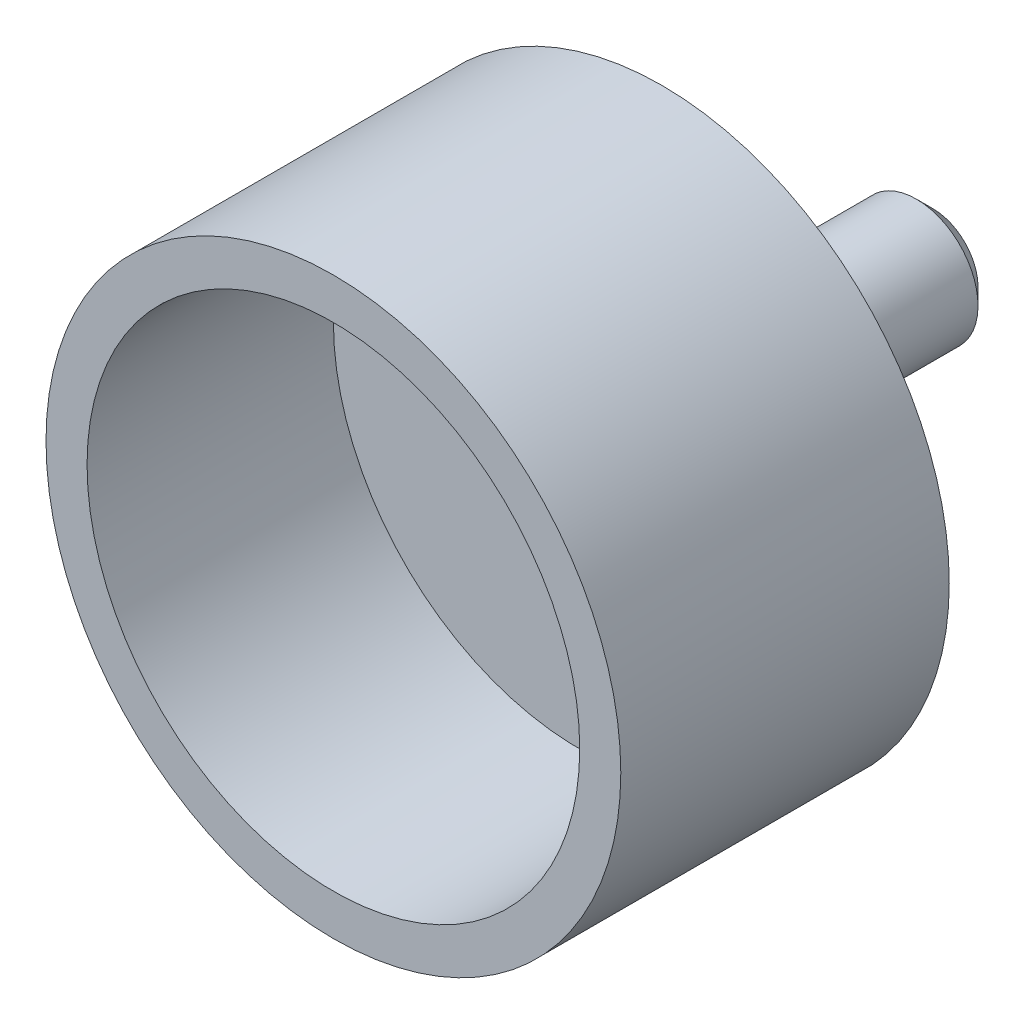
ISO-10303-21;
HEADER;
FILE_DESCRIPTION(('STEP AP214'),'2;1');
FILE_NAME('part.step','',(''),(''),'','','');
FILE_SCHEMA(('AUTOMOTIVE_DESIGN { 1 0 10303 214 1 1 1 1 }'));
ENDSEC;
DATA;
#1=APPLICATION_CONTEXT('core data for automotive mechanical design processes');
#2=APPLICATION_PROTOCOL_DEFINITION('international standard','automotive_design',2000,#1);
#3=PRODUCT_CONTEXT('',#1,'mechanical');
#4=PRODUCT('Part','Part','',(#3));
#5=PRODUCT_RELATED_PRODUCT_CATEGORY('part','',(#4));
#6=PRODUCT_DEFINITION_FORMATION('','',#4);
#7=PRODUCT_DEFINITION_CONTEXT('part definition',#1,'design');
#8=PRODUCT_DEFINITION('design','',#6,#7);
#9=PRODUCT_DEFINITION_SHAPE('','',#8);
#10=(LENGTH_UNIT() NAMED_UNIT(*) SI_UNIT(.MILLI.,.METRE.));
#11=(NAMED_UNIT(*) PLANE_ANGLE_UNIT() SI_UNIT($,.RADIAN.));
#12=(NAMED_UNIT(*) SI_UNIT($,.STERADIAN.) SOLID_ANGLE_UNIT());
#13=UNCERTAINTY_MEASURE_WITH_UNIT(LENGTH_MEASURE(1.E-05),#10,'distance_accuracy_value','');
#14=(GEOMETRIC_REPRESENTATION_CONTEXT(3) GLOBAL_UNCERTAINTY_ASSIGNED_CONTEXT((#13)) GLOBAL_UNIT_ASSIGNED_CONTEXT((#10,
#11,#12)) REPRESENTATION_CONTEXT('',''));
#15=CARTESIAN_POINT('',(0.,0.,0.));
#16=DIRECTION('',(0.,0.,1.));
#17=DIRECTION('',(1.,0.,0.));
#18=AXIS2_PLACEMENT_3D('',#15,#16,#17);
#19=CARTESIAN_POINT('',(0.,0.,35.));
#20=DIRECTION('',(0.,0.,-1.));
#21=DIRECTION('',(-1.,0.,0.));
#22=AXIS2_PLACEMENT_3D('',#19,#20,#21);
#23=CYLINDRICAL_SURFACE('',#22,35.);
#24=CARTESIAN_POINT('',(0.,0.,0.));
#25=DIRECTION('',(0.,0.,1.));
#26=DIRECTION('',(1.,0.,0.));
#27=AXIS2_PLACEMENT_3D('',#24,#25,#26);
#28=CIRCLE('',#27,35.);
#29=CARTESIAN_POINT('',(35.,0.,0.));
#30=VERTEX_POINT('',#29);
#31=EDGE_CURVE('E44',#30,#30,#28,.T.);
#32=ORIENTED_EDGE('',*,*,#31,.T.);
#33=EDGE_LOOP('',(#32));
#34=FACE_BOUND('',#33,.T.);
#35=CARTESIAN_POINT('',(0.,0.,40.));
#36=DIRECTION('',(0.,0.,1.));
#37=DIRECTION('',(1.,0.,0.));
#38=AXIS2_PLACEMENT_3D('',#35,#36,#37);
#39=CIRCLE('',#38,35.);
#40=CARTESIAN_POINT('',(35.,0.,40.));
#41=VERTEX_POINT('',#40);
#42=EDGE_CURVE('E48',#41,#41,#39,.T.);
#43=ORIENTED_EDGE('',*,*,#42,.F.);
#44=EDGE_LOOP('',(#43));
#45=FACE_BOUND('',#44,.T.);
#46=ADVANCED_FACE('F33',(#34,#45),#23,.T.);
#47=CARTESIAN_POINT('',(0.,0.,0.));
#48=DIRECTION('',(0.,0.,1.));
#49=DIRECTION('',(1.,0.,0.));
#50=AXIS2_PLACEMENT_3D('',#47,#48,#49);
#51=PLANE('',#50);
#52=CARTESIAN_POINT('',(0.,0.,0.));
#53=DIRECTION('',(0.,0.,-1.));
#54=DIRECTION('',(-1.,0.,0.));
#55=AXIS2_PLACEMENT_3D('',#52,#53,#54);
#56=CIRCLE('',#55,10.);
#57=CARTESIAN_POINT('',(9.45677565303164,-3.25106048055523,0.));
#58=VERTEX_POINT('',#57);
#59=EDGE_CURVE('E55',#58,#58,#56,.T.);
#60=ORIENTED_EDGE('',*,*,#59,.F.);
#61=EDGE_LOOP('',(#60));
#62=FACE_BOUND('',#61,.T.);
#63=ORIENTED_EDGE('',*,*,#31,.F.);
#64=EDGE_LOOP('',(#63));
#65=FACE_BOUND('',#64,.T.);
#66=ADVANCED_FACE('F98',(#62,#65),#51,.F.);
#67=CARTESIAN_POINT('',(0.,0.,40.));
#68=DIRECTION('',(0.,0.,1.));
#69=DIRECTION('',(1.,0.,0.));
#70=AXIS2_PLACEMENT_3D('',#67,#68,#69);
#71=PLANE('',#70);
#72=CARTESIAN_POINT('',(0.,0.,40.));
#73=DIRECTION('',(0.,0.,1.));
#74=DIRECTION('',(1.,0.,0.));
#75=AXIS2_PLACEMENT_3D('',#72,#73,#74);
#76=CIRCLE('',#75,30.);
#77=CARTESIAN_POINT('',(30.,0.,40.));
#78=VERTEX_POINT('',#77);
#79=EDGE_CURVE('E72',#78,#78,#76,.T.);
#80=ORIENTED_EDGE('',*,*,#79,.F.);
#81=EDGE_LOOP('',(#80));
#82=FACE_BOUND('',#81,.T.);
#83=ORIENTED_EDGE('',*,*,#42,.T.);
#84=EDGE_LOOP('',(#83));
#85=FACE_BOUND('',#84,.T.);
#86=ADVANCED_FACE('F87',(#82,#85),#71,.T.);
#87=CARTESIAN_POINT('',(9.45677565303164,-3.25106048055523,0.));
#88=CARTESIAN_POINT('',(7.05576388482705,2.54287160540407,-7.));
#89=CARTESIAN_POINT('',(2.95465469192116,-22.1646117866185,0.));
#90=CARTESIAN_POINT('',(12.1415070956352,-11.56865616425,-7.));
#91=CARTESIAN_POINT('',(-15.9588966141421,-15.662490825508,0.));
#92=CARTESIAN_POINT('',(-1.97002067401891,-16.6543993750582,-7.));
#93=CARTESIAN_POINT('',(-9.45677565303163,3.25106048055524,0.));
#94=CARTESIAN_POINT('',(-7.05576388482705,-2.54287160540407,-7.));
#95=CARTESIAN_POINT('',(-2.95465469192115,22.1646117866185,0.));
#96=CARTESIAN_POINT('',(-12.1415070956352,11.56865616425,-7.));
#97=CARTESIAN_POINT('',(15.9588966141421,15.662490825508,0.));
#98=CARTESIAN_POINT('',(1.97002067401891,16.6543993750582,-7.));
#99=CARTESIAN_POINT('',(9.45677565303164,-3.25106048055523,0.));
#100=CARTESIAN_POINT('',(7.05576388482705,2.54287160540407,-7.));
#101=(BOUNDED_SURFACE() B_SPLINE_SURFACE(3,1,((#87,#88),(#89,#90),(#91,#92),(#93,#94),(#95,#96),
(#97,#98),(#99,#100)),.UNSPECIFIED.,.T.,.F.,.F.) B_SPLINE_SURFACE_WITH_KNOTS((4,3,4),(2,2),(0.,
0.5,1.),(0.,1.),.UNSPECIFIED.) GEOMETRIC_REPRESENTATION_ITEM() RATIONAL_B_SPLINE_SURFACE(((1.,
1.),(0.333333333333333,0.333333333333333),(0.333333333333333,0.333333333333333),(1.,1.),
(0.333333333333333,0.333333333333333),(0.333333333333333,0.333333333333333),(1.,1.))) REPRESENTATION_ITEM('') SURFACE());
#102=CARTESIAN_POINT('',(0.,0.,-7.));
#103=DIRECTION('',(0.,0.,-1.));
#104=DIRECTION('',(-1.,0.,0.));
#105=AXIS2_PLACEMENT_3D('',#102,#103,#104);
#106=CIRCLE('',#105,7.5);
#107=CARTESIAN_POINT('',(7.05576388482705,2.54287160540407,-7.));
#108=VERTEX_POINT('',#107);
#109=EDGE_CURVE('E51',#108,#108,#106,.T.);
#110=CARTESIAN_POINT('',(9.45677565303164,-3.25106048055523,0.));
#111=CARTESIAN_POINT('',(9.43176511377951,-3.19070702132649,-0.0729166666666664));
#112=CARTESIAN_POINT('',(9.40675457452737,-3.13035356209775,-0.145833333333333));
#113=CARTESIAN_POINT('',(9.35673349602311,-3.00964664364026,-0.291666666666667));
#114=CARTESIAN_POINT('',(9.33172295677098,-2.94929318441152,-0.364583333333333));
#115=CARTESIAN_POINT('',(9.28170187826672,-2.82858626595403,-0.510416666666667));
#116=CARTESIAN_POINT('',(9.25669133901459,-2.76823280672529,-0.583333333333333));
#117=CARTESIAN_POINT('',(9.20667026051033,-2.64752588826781,-0.729166666666667));
#118=CARTESIAN_POINT('',(9.1816597212582,-2.58717242903906,-0.802083333333333));
#119=CARTESIAN_POINT('',(9.13163864275393,-2.46646551058158,-0.947916666666667));
#120=CARTESIAN_POINT('',(9.1066281035018,-2.40611205135284,-1.02083333333333));
#121=CARTESIAN_POINT('',(9.05660702499754,-2.28540513289535,-1.16666666666667));
#122=CARTESIAN_POINT('',(9.03159648574541,-2.22505167366661,-1.23958333333333));
#123=CARTESIAN_POINT('',(8.98157540724115,-2.10434475520912,-1.38541666666667));
#124=CARTESIAN_POINT('',(8.95656486798902,-2.04399129598038,-1.45833333333333));
#125=CARTESIAN_POINT('',(8.90654378948475,-1.92328437752289,-1.60416666666667));
#126=CARTESIAN_POINT('',(8.88153325023262,-1.86293091829415,-1.67708333333333));
#127=CARTESIAN_POINT('',(8.83151217172836,-1.74222399983666,-1.82291666666667));
#128=CARTESIAN_POINT('',(8.80650163247623,-1.68187054060792,-1.89583333333333));
#129=CARTESIAN_POINT('',(8.75648055397197,-1.56116362215044,-2.04166666666667));
#130=CARTESIAN_POINT('',(8.73147001471984,-1.50081016292169,-2.11458333333333));
#131=CARTESIAN_POINT('',(8.68144893621557,-1.38010324446421,-2.26041666666667));
#132=CARTESIAN_POINT('',(8.65643839696344,-1.31974978523547,-2.33333333333333));
#133=CARTESIAN_POINT('',(8.60641731845918,-1.19904286677798,-2.47916666666667));
#134=CARTESIAN_POINT('',(8.58140677920705,-1.13868940754924,-2.55208333333333));
#135=CARTESIAN_POINT('',(8.53138570070279,-1.01798248909175,-2.69791666666667));
#136=CARTESIAN_POINT('',(8.50637516145066,-0.957629029863009,-2.77083333333333));
#137=CARTESIAN_POINT('',(8.45635408294639,-0.836922111405524,-2.91666666666667));
#138=CARTESIAN_POINT('',(8.43134354369426,-0.776568652176781,-2.98958333333333));
#139=CARTESIAN_POINT('',(8.38132246519,-0.655861733719295,-3.13541666666667));
#140=CARTESIAN_POINT('',(8.35631192593787,-0.595508274490552,-3.20833333333333));
#141=CARTESIAN_POINT('',(8.30629084743361,-0.474801356033067,-3.35416666666667));
#142=CARTESIAN_POINT('',(8.28128030818148,-0.414447896804324,-3.42708333333333));
#143=CARTESIAN_POINT('',(8.23125922967721,-0.293740978346839,-3.57291666666667));
#144=CARTESIAN_POINT('',(8.20624869042508,-0.233387519118096,-3.64583333333333));
#145=CARTESIAN_POINT('',(8.15622761192082,-0.11268060066061,-3.79166666666667));
#146=CARTESIAN_POINT('',(8.13121707266869,-0.0523271414318675,-3.86458333333333));
#147=CARTESIAN_POINT('',(8.08119599416442,0.0683797770256181,-4.01041666666667));
#148=CARTESIAN_POINT('',(8.0561854549123,0.128733236254361,-4.08333333333333));
#149=CARTESIAN_POINT('',(8.00616437640803,0.249440154711846,-4.22916666666667));
#150=CARTESIAN_POINT('',(7.9811538371559,0.309793613940589,-4.30208333333333));
#151=CARTESIAN_POINT('',(7.93113275865164,0.430500532398075,-4.44791666666667));
#152=CARTESIAN_POINT('',(7.90612221939951,0.490853991626818,-4.52083333333333));
#153=CARTESIAN_POINT('',(7.85610114089525,0.611560910084303,-4.66666666666667));
#154=CARTESIAN_POINT('',(7.83109060164311,0.671914369313046,-4.73958333333333));
#155=CARTESIAN_POINT('',(7.78106952313885,0.792621287770531,-4.88541666666667));
#156=CARTESIAN_POINT('',(7.75605898388672,0.852974746999274,-4.95833333333333));
#157=CARTESIAN_POINT('',(7.70603790538246,0.973681665456759,-5.10416666666667));
#158=CARTESIAN_POINT('',(7.68102736613033,1.0340351246855,-5.17708333333333));
#159=CARTESIAN_POINT('',(7.63100628762607,1.15474204314299,-5.32291666666667));
#160=CARTESIAN_POINT('',(7.60599574837394,1.21509550237173,-5.39583333333333));
#161=CARTESIAN_POINT('',(7.55597466986967,1.33580242082922,-5.54166666666667));
#162=CARTESIAN_POINT('',(7.53096413061754,1.39615588005796,-5.61458333333333));
#163=CARTESIAN_POINT('',(7.48094305211328,1.51686279851544,-5.76041666666667));
#164=CARTESIAN_POINT('',(7.45593251286115,1.57721625774419,-5.83333333333333));
#165=CARTESIAN_POINT('',(7.40591143435689,1.69792317620167,-5.97916666666667));
#166=CARTESIAN_POINT('',(7.38090089510476,1.75827663543042,-6.05208333333333));
#167=CARTESIAN_POINT('',(7.33087981660049,1.8789835538879,-6.19791666666667));
#168=CARTESIAN_POINT('',(7.30586927734836,1.93933701311664,-6.27083333333333));
#169=CARTESIAN_POINT('',(7.2558481988441,2.06004393157413,-6.41666666666667));
#170=CARTESIAN_POINT('',(7.23083765959197,2.12039739080287,-6.48958333333333));
#171=CARTESIAN_POINT('',(7.18081658108771,2.24110430926036,-6.63541666666667));
#172=CARTESIAN_POINT('',(7.15580604183558,2.3014577684891,-6.70833333333333));
#173=CARTESIAN_POINT('',(7.10578496333131,2.42216468694659,-6.85416666666667));
#174=CARTESIAN_POINT('',(7.08077442407918,2.48251814617533,-6.92708333333333));
#175=CARTESIAN_POINT('',(7.05576388482705,2.54287160540407,-7.));
#176=B_SPLINE_CURVE_WITH_KNOTS('',3,(#110,#111,#112,#113,#114,#115,#116,#117,#118,#119,#120,
#121,#122,#123,#124,#125,#126,#127,#128,#129,#130,#131,#132,#133,#134,#135,#136,#137,#138,#139,
#140,#141,#142,#143,#144,#145,#146,#147,#148,#149,#150,#151,#152,#153,#154,#155,#156,#157,#158,
#159,#160,#161,#162,#163,#164,#165,#166,#167,#168,#169,#170,#171,#172,#173,#174,#175),
.UNSPECIFIED.,.F.,.F.,(4,2,2,2,2,2,2,2,2,2,2,2,2,2,2,2,2,2,2,2,2,2,2,2,2,2,2,2,2,2,2,2,4),(0.,
0.293707620825578,0.587415241651155,0.881122862476732,1.17483048330231,1.46853810412789,
1.76224572495347,2.05595334577904,2.34966096660462,2.6433685874302,2.93707620825577,
3.23078382908135,3.52449144990693,3.81819907073251,4.11190669155808,4.40561431238366,
4.69932193320924,4.99302955403482,5.28673717486039,5.58044479568597,5.87415241651155,
6.16786003733712,6.4615676581627,6.75527527898828,7.04898289981386,7.34269052063943,
7.63639814146501,7.93010576229059,8.22381338311617,8.51752100394175,8.81122862476732,
9.1049362455929,9.39864386641848),.UNSPECIFIED.);
#177=EDGE_CURVE('BSEAM70',#58,#108,#176,.T.);
#178=ORIENTED_EDGE('',*,*,#59,.T.);
#179=ORIENTED_EDGE('',*,*,#109,.F.);
#180=ORIENTED_EDGE('',*,*,#177,.T.);
#181=ORIENTED_EDGE('',*,*,#177,.F.);
#182=EDGE_LOOP('',(#178,#180,#179,#181));
#183=FACE_BOUND('',#182,.T.);
#184=ADVANCED_FACE('F70',(#183),#101,.T.);
#185=CARTESIAN_POINT('',(0.,0.,-33.));
#186=DIRECTION('',(0.,0.,1.));
#187=DIRECTION('',(1.,0.,0.));
#188=AXIS2_PLACEMENT_3D('',#185,#186,#187);
#189=CYLINDRICAL_SURFACE('',#188,7.5);
#190=CARTESIAN_POINT('',(0.,0.,-31.));
#191=DIRECTION('',(0.,0.,-1.));
#192=DIRECTION('',(-1.,0.,0.));
#193=AXIS2_PLACEMENT_3D('',#190,#191,#192);
#194=CIRCLE('',#193,7.5);
#195=CARTESIAN_POINT('',(-7.5,0.,-31.));
#196=VERTEX_POINT('',#195);
#197=EDGE_CURVE('E11',#196,#196,#194,.F.);
#198=ORIENTED_EDGE('',*,*,#197,.T.);
#199=EDGE_LOOP('',(#198));
#200=FACE_BOUND('',#199,.T.);
#201=ORIENTED_EDGE('',*,*,#109,.T.);
#202=EDGE_LOOP('',(#201));
#203=FACE_BOUND('',#202,.T.);
#204=ADVANCED_FACE('F67',(#200,#203),#189,.T.);
#205=CARTESIAN_POINT('',(0.,0.,-33.));
#206=DIRECTION('',(0.,0.,-1.));
#207=DIRECTION('',(-1.,0.,0.));
#208=AXIS2_PLACEMENT_3D('',#205,#206,#207);
#209=PLANE('',#208);
#210=CARTESIAN_POINT('',(0.,0.,-33.));
#211=DIRECTION('',(0.,0.,-1.));
#212=DIRECTION('',(-1.,0.,0.));
#213=AXIS2_PLACEMENT_3D('',#210,#211,#212);
#214=CIRCLE('',#213,5.49999999999999);
#215=CARTESIAN_POINT('',(-5.49999999999999,0.,-33.));
#216=VERTEX_POINT('',#215);
#217=EDGE_CURVE('E40',#216,#216,#214,.T.);
#218=ORIENTED_EDGE('',*,*,#217,.T.);
#219=EDGE_LOOP('',(#218));
#220=FACE_BOUND('',#219,.T.);
#221=ADVANCED_FACE('F131',(#220),#209,.T.);
#222=CARTESIAN_POINT('',(0.,0.,-33.));
#223=DIRECTION('',(0.,0.,1.));
#224=DIRECTION('',(1.,0.,0.));
#225=AXIS2_PLACEMENT_3D('',#222,#223,#224);
#226=CONICAL_SURFACE('',#225,5.49999999999999,0.785398163397449);
#227=ORIENTED_EDGE('',*,*,#197,.F.);
#228=EDGE_LOOP('',(#227));
#229=FACE_BOUND('',#228,.T.);
#230=ORIENTED_EDGE('',*,*,#217,.F.);
#231=EDGE_LOOP('',(#230));
#232=FACE_BOUND('',#231,.T.);
#233=ADVANCED_FACE('F35',(#229,#232),#226,.T.);
#234=CARTESIAN_POINT('',(0.,0.,9.99999999999998));
#235=DIRECTION('',(0.,0.,1.));
#236=DIRECTION('',(1.,0.,0.));
#237=AXIS2_PLACEMENT_3D('',#234,#235,#236);
#238=CYLINDRICAL_SURFACE('',#237,30.);
#239=CARTESIAN_POINT('',(0.,0.,9.99999999999998));
#240=DIRECTION('',(0.,0.,1.));
#241=DIRECTION('',(1.,0.,0.));
#242=AXIS2_PLACEMENT_3D('',#239,#240,#241);
#243=CIRCLE('',#242,30.);
#244=CARTESIAN_POINT('',(30.,0.,9.99999999999998));
#245=VERTEX_POINT('',#244);
#246=EDGE_CURVE('E181',#245,#245,#243,.T.);
#247=ORIENTED_EDGE('',*,*,#246,.F.);
#248=EDGE_LOOP('',(#247));
#249=FACE_BOUND('',#248,.T.);
#250=ORIENTED_EDGE('',*,*,#79,.T.);
#251=EDGE_LOOP('',(#250));
#252=FACE_BOUND('',#251,.T.);
#253=ADVANCED_FACE('F141',(#249,#252),#238,.F.);
#254=CARTESIAN_POINT('',(0.,0.,9.99999999999998));
#255=DIRECTION('',(0.,0.,1.));
#256=DIRECTION('',(1.,0.,0.));
#257=AXIS2_PLACEMENT_3D('',#254,#255,#256);
#258=PLANE('',#257);
#259=ORIENTED_EDGE('',*,*,#246,.T.);
#260=EDGE_LOOP('',(#259));
#261=FACE_BOUND('',#260,.T.);
#262=ADVANCED_FACE('F147',(#261),#258,.T.);
#263=CLOSED_SHELL('',(#46,#66,#86,#184,#204,#221,#233,#253,#262));
#264=MANIFOLD_SOLID_BREP('B2',#263);
#265=ADVANCED_BREP_SHAPE_REPRESENTATION('',(#18,#264),#14);
#266=SHAPE_DEFINITION_REPRESENTATION(#9,#265);
ENDSEC;
END-ISO-10303-21;
